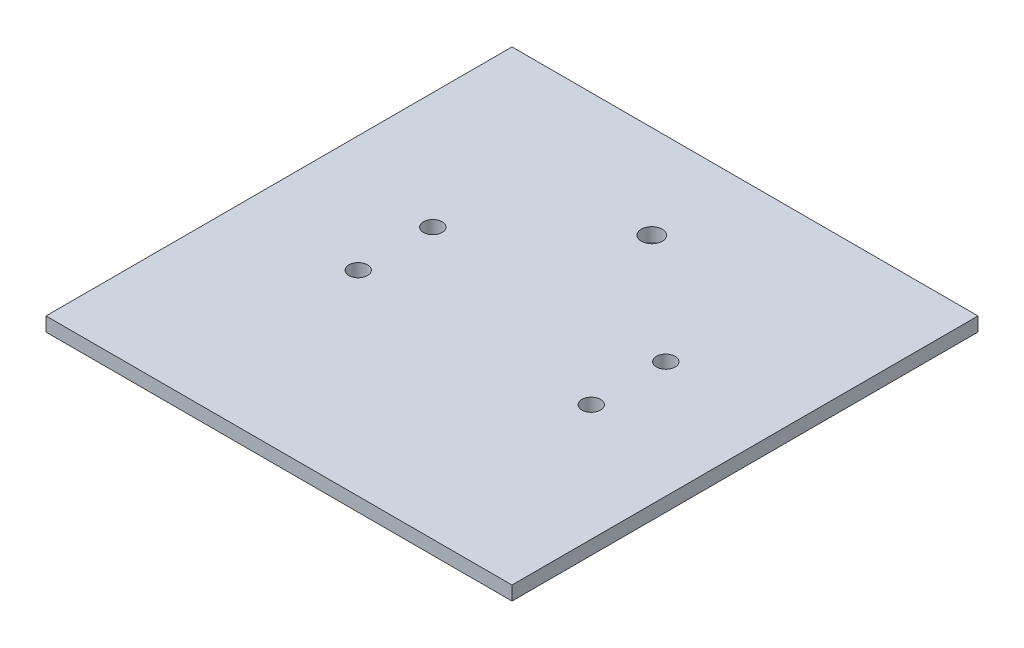
ISO-10303-21;
HEADER;
FILE_DESCRIPTION(('STEP AP214'),'2;1');
FILE_NAME('part.step','',(''),(''),'','','');
FILE_SCHEMA(('AUTOMOTIVE_DESIGN { 1 0 10303 214 1 1 1 1 }'));
ENDSEC;
DATA;
#1=APPLICATION_CONTEXT('core data for automotive mechanical design processes');
#2=APPLICATION_PROTOCOL_DEFINITION('international standard','automotive_design',2000,#1);
#3=PRODUCT_CONTEXT('',#1,'mechanical');
#4=PRODUCT('Part','Part','',(#3));
#5=PRODUCT_RELATED_PRODUCT_CATEGORY('part','',(#4));
#6=PRODUCT_DEFINITION_FORMATION('','',#4);
#7=PRODUCT_DEFINITION_CONTEXT('part definition',#1,'design');
#8=PRODUCT_DEFINITION('design','',#6,#7);
#9=PRODUCT_DEFINITION_SHAPE('','',#8);
#10=(LENGTH_UNIT() NAMED_UNIT(*) SI_UNIT(.MILLI.,.METRE.));
#11=(NAMED_UNIT(*) PLANE_ANGLE_UNIT() SI_UNIT($,.RADIAN.));
#12=(NAMED_UNIT(*) SI_UNIT($,.STERADIAN.) SOLID_ANGLE_UNIT());
#13=UNCERTAINTY_MEASURE_WITH_UNIT(LENGTH_MEASURE(1.E-05),#10,'distance_accuracy_value','');
#14=(GEOMETRIC_REPRESENTATION_CONTEXT(3) GLOBAL_UNCERTAINTY_ASSIGNED_CONTEXT((#13)) GLOBAL_UNIT_ASSIGNED_CONTEXT((#10,
#11,#12)) REPRESENTATION_CONTEXT('',''));
#15=CARTESIAN_POINT('',(0.,0.,0.));
#16=DIRECTION('',(0.,0.,1.));
#17=DIRECTION('',(1.,0.,0.));
#18=AXIS2_PLACEMENT_3D('',#15,#16,#17);
#19=CARTESIAN_POINT('',(0.,6.,0.));
#20=DIRECTION('',(0.,1.,0.));
#21=DIRECTION('',(0.,0.,1.));
#22=AXIS2_PLACEMENT_3D('',#19,#20,#21);
#23=PLANE('',#22);
#24=CARTESIAN_POINT('',(-50.,6.,16.));
#25=DIRECTION('',(0.,1.,0.));
#26=DIRECTION('',(0.,0.,-1.));
#27=AXIS2_PLACEMENT_3D('',#24,#25,#26);
#28=CIRCLE('',#27,4.);
#29=CARTESIAN_POINT('',(-50.,6.,12.));
#30=VERTEX_POINT('',#29);
#31=EDGE_CURVE('E129',#30,#30,#28,.T.);
#32=ORIENTED_EDGE('',*,*,#31,.F.);
#33=EDGE_LOOP('',(#32));
#34=FACE_BOUND('',#33,.T.);
#35=CARTESIAN_POINT('',(0.,6.,-60.));
#36=DIRECTION('',(0.,1.,0.));
#37=DIRECTION('',(0.,0.,1.));
#38=AXIS2_PLACEMENT_3D('',#35,#36,#37);
#39=CIRCLE('',#38,4.5);
#40=CARTESIAN_POINT('',(0.,6.,-55.5));
#41=VERTEX_POINT('',#40);
#42=EDGE_CURVE('E117',#41,#41,#39,.T.);
#43=ORIENTED_EDGE('',*,*,#42,.F.);
#44=EDGE_LOOP('',(#43));
#45=FACE_BOUND('',#44,.T.);
#46=DIRECTION('',(0.,0.,1.));
#47=VECTOR('',#46,1.);
#48=CARTESIAN_POINT('',(-100.,6.,-100.));
#49=LINE('',#48,#47);
#50=CARTESIAN_POINT('',(-100.,6.,-100.));
#51=VERTEX_POINT('',#50);
#52=CARTESIAN_POINT('',(-100.,6.,100.));
#53=VERTEX_POINT('',#52);
#54=EDGE_CURVE('E87',#51,#53,#49,.T.);
#55=ORIENTED_EDGE('',*,*,#54,.T.);
#56=DIRECTION('',(1.,0.,0.));
#57=VECTOR('',#56,1.);
#58=CARTESIAN_POINT('',(-100.,6.,100.));
#59=LINE('',#58,#57);
#60=CARTESIAN_POINT('',(100.,6.,100.));
#61=VERTEX_POINT('',#60);
#62=EDGE_CURVE('E82',#53,#61,#59,.T.);
#63=ORIENTED_EDGE('',*,*,#62,.T.);
#64=DIRECTION('',(0.,0.,-1.));
#65=VECTOR('',#64,1.);
#66=CARTESIAN_POINT('',(100.,6.,-100.));
#67=LINE('',#66,#65);
#68=CARTESIAN_POINT('',(100.,6.,-100.));
#69=VERTEX_POINT('',#68);
#70=EDGE_CURVE('E85',#61,#69,#67,.T.);
#71=ORIENTED_EDGE('',*,*,#70,.T.);
#72=DIRECTION('',(-1.,0.,0.));
#73=VECTOR('',#72,1.);
#74=CARTESIAN_POINT('',(-100.,6.,-100.));
#75=LINE('',#74,#73);
#76=EDGE_CURVE('E52',#69,#51,#75,.T.);
#77=ORIENTED_EDGE('',*,*,#76,.T.);
#78=EDGE_LOOP('',(#55,#63,#71,#77));
#79=FACE_BOUND('',#78,.T.);
#80=CARTESIAN_POINT('',(50.,6.,-16.));
#81=DIRECTION('',(0.,1.,0.));
#82=DIRECTION('',(0.,0.,1.));
#83=AXIS2_PLACEMENT_3D('',#80,#81,#82);
#84=CIRCLE('',#83,4.);
#85=CARTESIAN_POINT('',(50.,6.,-12.));
#86=VERTEX_POINT('',#85);
#87=EDGE_CURVE('E102',#86,#86,#84,.T.);
#88=ORIENTED_EDGE('',*,*,#87,.F.);
#89=EDGE_LOOP('',(#88));
#90=FACE_BOUND('',#89,.T.);
#91=CARTESIAN_POINT('',(50.,6.,16.));
#92=DIRECTION('',(0.,1.,0.));
#93=DIRECTION('',(0.,0.,1.));
#94=AXIS2_PLACEMENT_3D('',#91,#92,#93);
#95=CIRCLE('',#94,4.);
#96=CARTESIAN_POINT('',(50.,6.,20.));
#97=VERTEX_POINT('',#96);
#98=EDGE_CURVE('E123',#97,#97,#95,.T.);
#99=ORIENTED_EDGE('',*,*,#98,.F.);
#100=EDGE_LOOP('',(#99));
#101=FACE_BOUND('',#100,.T.);
#102=CARTESIAN_POINT('',(-50.,6.,-16.));
#103=DIRECTION('',(0.,1.,0.));
#104=DIRECTION('',(0.,0.,-1.));
#105=AXIS2_PLACEMENT_3D('',#102,#103,#104);
#106=CIRCLE('',#105,4.);
#107=CARTESIAN_POINT('',(-50.,6.,-20.));
#108=VERTEX_POINT('',#107);
#109=EDGE_CURVE('E135',#108,#108,#106,.T.);
#110=ORIENTED_EDGE('',*,*,#109,.F.);
#111=EDGE_LOOP('',(#110));
#112=FACE_BOUND('',#111,.T.);
#113=ADVANCED_FACE('F35',(#34,#45,#79,#90,#101,#112),#23,.T.);
#114=CARTESIAN_POINT('',(0.,0.,0.));
#115=DIRECTION('',(0.,1.,0.));
#116=DIRECTION('',(0.,0.,1.));
#117=AXIS2_PLACEMENT_3D('',#114,#115,#116);
#118=PLANE('',#117);
#119=DIRECTION('',(0.,0.,1.));
#120=VECTOR('',#119,1.);
#121=CARTESIAN_POINT('',(-100.,0.,-100.));
#122=LINE('',#121,#120);
#123=CARTESIAN_POINT('',(-100.,0.,-100.));
#124=VERTEX_POINT('',#123);
#125=CARTESIAN_POINT('',(-100.,0.,100.));
#126=VERTEX_POINT('',#125);
#127=EDGE_CURVE('E99',#124,#126,#122,.T.);
#128=ORIENTED_EDGE('',*,*,#127,.F.);
#129=DIRECTION('',(-1.,0.,0.));
#130=VECTOR('',#129,1.);
#131=CARTESIAN_POINT('',(-100.,0.,-100.));
#132=LINE('',#131,#130);
#133=CARTESIAN_POINT('',(100.,0.,-100.));
#134=VERTEX_POINT('',#133);
#135=EDGE_CURVE('E75',#134,#124,#132,.T.);
#136=ORIENTED_EDGE('',*,*,#135,.F.);
#137=DIRECTION('',(0.,0.,-1.));
#138=VECTOR('',#137,1.);
#139=CARTESIAN_POINT('',(100.,0.,-100.));
#140=LINE('',#139,#138);
#141=CARTESIAN_POINT('',(100.,0.,100.));
#142=VERTEX_POINT('',#141);
#143=EDGE_CURVE('E69',#142,#134,#140,.T.);
#144=ORIENTED_EDGE('',*,*,#143,.F.);
#145=DIRECTION('',(1.,0.,0.));
#146=VECTOR('',#145,1.);
#147=CARTESIAN_POINT('',(-100.,0.,100.));
#148=LINE('',#147,#146);
#149=EDGE_CURVE('E91',#126,#142,#148,.T.);
#150=ORIENTED_EDGE('',*,*,#149,.F.);
#151=EDGE_LOOP('',(#128,#136,#144,#150));
#152=FACE_BOUND('',#151,.T.);
#153=CARTESIAN_POINT('',(50.,0.,-16.));
#154=DIRECTION('',(0.,1.,0.));
#155=DIRECTION('',(0.,0.,1.));
#156=AXIS2_PLACEMENT_3D('',#153,#154,#155);
#157=CIRCLE('',#156,4.);
#158=CARTESIAN_POINT('',(50.,0.,-12.));
#159=VERTEX_POINT('',#158);
#160=EDGE_CURVE('E114',#159,#159,#157,.T.);
#161=ORIENTED_EDGE('',*,*,#160,.T.);
#162=EDGE_LOOP('',(#161));
#163=FACE_BOUND('',#162,.T.);
#164=CARTESIAN_POINT('',(0.,0.,-60.));
#165=DIRECTION('',(0.,1.,0.));
#166=DIRECTION('',(0.,0.,1.));
#167=AXIS2_PLACEMENT_3D('',#164,#165,#166);
#168=CIRCLE('',#167,4.5);
#169=CARTESIAN_POINT('',(0.,0.,-55.5));
#170=VERTEX_POINT('',#169);
#171=EDGE_CURVE('E120',#170,#170,#168,.T.);
#172=ORIENTED_EDGE('',*,*,#171,.T.);
#173=EDGE_LOOP('',(#172));
#174=FACE_BOUND('',#173,.T.);
#175=CARTESIAN_POINT('',(50.,0.,16.));
#176=DIRECTION('',(0.,1.,0.));
#177=DIRECTION('',(0.,0.,1.));
#178=AXIS2_PLACEMENT_3D('',#175,#176,#177);
#179=CIRCLE('',#178,4.);
#180=CARTESIAN_POINT('',(50.,0.,20.));
#181=VERTEX_POINT('',#180);
#182=EDGE_CURVE('E126',#181,#181,#179,.T.);
#183=ORIENTED_EDGE('',*,*,#182,.T.);
#184=EDGE_LOOP('',(#183));
#185=FACE_BOUND('',#184,.T.);
#186=CARTESIAN_POINT('',(-50.,0.,16.));
#187=DIRECTION('',(0.,1.,0.));
#188=DIRECTION('',(0.,0.,-1.));
#189=AXIS2_PLACEMENT_3D('',#186,#187,#188);
#190=CIRCLE('',#189,4.);
#191=CARTESIAN_POINT('',(-50.,0.,12.));
#192=VERTEX_POINT('',#191);
#193=EDGE_CURVE('E132',#192,#192,#190,.T.);
#194=ORIENTED_EDGE('',*,*,#193,.T.);
#195=EDGE_LOOP('',(#194));
#196=FACE_BOUND('',#195,.T.);
#197=CARTESIAN_POINT('',(-50.,0.,-16.));
#198=DIRECTION('',(0.,1.,0.));
#199=DIRECTION('',(0.,0.,-1.));
#200=AXIS2_PLACEMENT_3D('',#197,#198,#199);
#201=CIRCLE('',#200,4.);
#202=CARTESIAN_POINT('',(-50.,0.,-20.));
#203=VERTEX_POINT('',#202);
#204=EDGE_CURVE('E138',#203,#203,#201,.T.);
#205=ORIENTED_EDGE('',*,*,#204,.T.);
#206=EDGE_LOOP('',(#205));
#207=FACE_BOUND('',#206,.T.);
#208=ADVANCED_FACE('F110',(#152,#163,#174,#185,#196,#207),#118,.F.);
#209=CARTESIAN_POINT('',(-100.,6.,-100.));
#210=DIRECTION('',(1.,0.,0.));
#211=DIRECTION('',(0.,0.,-1.));
#212=AXIS2_PLACEMENT_3D('',#209,#210,#211);
#213=PLANE('',#212);
#214=ORIENTED_EDGE('',*,*,#127,.T.);
#215=DIRECTION('',(0.,-1.,0.));
#216=VECTOR('',#215,1.);
#217=CARTESIAN_POINT('',(-100.,6.,100.));
#218=LINE('',#217,#216);
#219=EDGE_CURVE('E11',#53,#126,#218,.T.);
#220=ORIENTED_EDGE('',*,*,#219,.F.);
#221=ORIENTED_EDGE('',*,*,#54,.F.);
#222=DIRECTION('',(0.,-1.,0.));
#223=VECTOR('',#222,1.);
#224=CARTESIAN_POINT('',(-100.,6.,-100.));
#225=LINE('',#224,#223);
#226=EDGE_CURVE('E95',#51,#124,#225,.T.);
#227=ORIENTED_EDGE('',*,*,#226,.T.);
#228=EDGE_LOOP('',(#214,#220,#221,#227));
#229=FACE_BOUND('',#228,.T.);
#230=ADVANCED_FACE('F37',(#229),#213,.F.);
#231=CARTESIAN_POINT('',(-100.,6.,100.));
#232=DIRECTION('',(0.,0.,-1.));
#233=DIRECTION('',(-1.,0.,0.));
#234=AXIS2_PLACEMENT_3D('',#231,#232,#233);
#235=PLANE('',#234);
#236=ORIENTED_EDGE('',*,*,#149,.T.);
#237=DIRECTION('',(0.,-1.,0.));
#238=VECTOR('',#237,1.);
#239=CARTESIAN_POINT('',(100.,6.,100.));
#240=LINE('',#239,#238);
#241=EDGE_CURVE('E44',#61,#142,#240,.T.);
#242=ORIENTED_EDGE('',*,*,#241,.F.);
#243=ORIENTED_EDGE('',*,*,#62,.F.);
#244=ORIENTED_EDGE('',*,*,#219,.T.);
#245=EDGE_LOOP('',(#236,#242,#243,#244));
#246=FACE_BOUND('',#245,.T.);
#247=ADVANCED_FACE('F90',(#246),#235,.F.);
#248=CARTESIAN_POINT('',(100.,6.,-100.));
#249=DIRECTION('',(-1.,0.,0.));
#250=DIRECTION('',(0.,0.,1.));
#251=AXIS2_PLACEMENT_3D('',#248,#249,#250);
#252=PLANE('',#251);
#253=ORIENTED_EDGE('',*,*,#143,.T.);
#254=DIRECTION('',(0.,-1.,0.));
#255=VECTOR('',#254,1.);
#256=CARTESIAN_POINT('',(100.,6.,-100.));
#257=LINE('',#256,#255);
#258=EDGE_CURVE('E92',#69,#134,#257,.T.);
#259=ORIENTED_EDGE('',*,*,#258,.F.);
#260=ORIENTED_EDGE('',*,*,#70,.F.);
#261=ORIENTED_EDGE('',*,*,#241,.T.);
#262=EDGE_LOOP('',(#253,#259,#260,#261));
#263=FACE_BOUND('',#262,.T.);
#264=ADVANCED_FACE('F93',(#263),#252,.F.);
#265=CARTESIAN_POINT('',(-100.,6.,-100.));
#266=DIRECTION('',(0.,0.,1.));
#267=DIRECTION('',(1.,0.,0.));
#268=AXIS2_PLACEMENT_3D('',#265,#266,#267);
#269=PLANE('',#268);
#270=ORIENTED_EDGE('',*,*,#135,.T.);
#271=ORIENTED_EDGE('',*,*,#226,.F.);
#272=ORIENTED_EDGE('',*,*,#76,.F.);
#273=ORIENTED_EDGE('',*,*,#258,.T.);
#274=EDGE_LOOP('',(#270,#271,#272,#273));
#275=FACE_BOUND('',#274,.T.);
#276=ADVANCED_FACE('F107',(#275),#269,.F.);
#277=CARTESIAN_POINT('',(50.,6.,-16.));
#278=DIRECTION('',(0.,-1.,0.));
#279=DIRECTION('',(0.,0.,-1.));
#280=AXIS2_PLACEMENT_3D('',#277,#278,#279);
#281=CYLINDRICAL_SURFACE('',#280,4.);
#282=ORIENTED_EDGE('',*,*,#87,.T.);
#283=EDGE_LOOP('',(#282));
#284=FACE_BOUND('',#283,.T.);
#285=ORIENTED_EDGE('',*,*,#160,.F.);
#286=EDGE_LOOP('',(#285));
#287=FACE_BOUND('',#286,.T.);
#288=ADVANCED_FACE('F157',(#284,#287),#281,.F.);
#289=CARTESIAN_POINT('',(0.,6.,-60.));
#290=DIRECTION('',(0.,-1.,0.));
#291=DIRECTION('',(0.,0.,-1.));
#292=AXIS2_PLACEMENT_3D('',#289,#290,#291);
#293=CYLINDRICAL_SURFACE('',#292,4.5);
#294=ORIENTED_EDGE('',*,*,#42,.T.);
#295=EDGE_LOOP('',(#294));
#296=FACE_BOUND('',#295,.T.);
#297=ORIENTED_EDGE('',*,*,#171,.F.);
#298=EDGE_LOOP('',(#297));
#299=FACE_BOUND('',#298,.T.);
#300=ADVANCED_FACE('F203',(#296,#299),#293,.F.);
#301=CARTESIAN_POINT('',(50.,6.,16.));
#302=DIRECTION('',(0.,-1.,0.));
#303=DIRECTION('',(0.,0.,-1.));
#304=AXIS2_PLACEMENT_3D('',#301,#302,#303);
#305=CYLINDRICAL_SURFACE('',#304,4.);
#306=ORIENTED_EDGE('',*,*,#98,.T.);
#307=EDGE_LOOP('',(#306));
#308=FACE_BOUND('',#307,.T.);
#309=ORIENTED_EDGE('',*,*,#182,.F.);
#310=EDGE_LOOP('',(#309));
#311=FACE_BOUND('',#310,.T.);
#312=ADVANCED_FACE('F211',(#308,#311),#305,.F.);
#313=CARTESIAN_POINT('',(-50.,6.,16.));
#314=DIRECTION('',(0.,-1.,0.));
#315=DIRECTION('',(0.,0.,-1.));
#316=AXIS2_PLACEMENT_3D('',#313,#314,#315);
#317=CYLINDRICAL_SURFACE('',#316,4.);
#318=ORIENTED_EDGE('',*,*,#31,.T.);
#319=EDGE_LOOP('',(#318));
#320=FACE_BOUND('',#319,.T.);
#321=ORIENTED_EDGE('',*,*,#193,.F.);
#322=EDGE_LOOP('',(#321));
#323=FACE_BOUND('',#322,.T.);
#324=ADVANCED_FACE('F219',(#320,#323),#317,.F.);
#325=CARTESIAN_POINT('',(-50.,6.,-16.));
#326=DIRECTION('',(0.,-1.,0.));
#327=DIRECTION('',(0.,0.,-1.));
#328=AXIS2_PLACEMENT_3D('',#325,#326,#327);
#329=CYLINDRICAL_SURFACE('',#328,4.);
#330=ORIENTED_EDGE('',*,*,#109,.T.);
#331=EDGE_LOOP('',(#330));
#332=FACE_BOUND('',#331,.T.);
#333=ORIENTED_EDGE('',*,*,#204,.F.);
#334=EDGE_LOOP('',(#333));
#335=FACE_BOUND('',#334,.T.);
#336=ADVANCED_FACE('F144',(#332,#335),#329,.F.);
#337=CLOSED_SHELL('',(#113,#208,#230,#247,#264,#276,#288,#300,#312,#324,#336));
#338=MANIFOLD_SOLID_BREP('B2',#337);
#339=ADVANCED_BREP_SHAPE_REPRESENTATION('',(#18,#338),#14);
#340=SHAPE_DEFINITION_REPRESENTATION(#9,#339);
ENDSEC;
END-ISO-10303-21;
